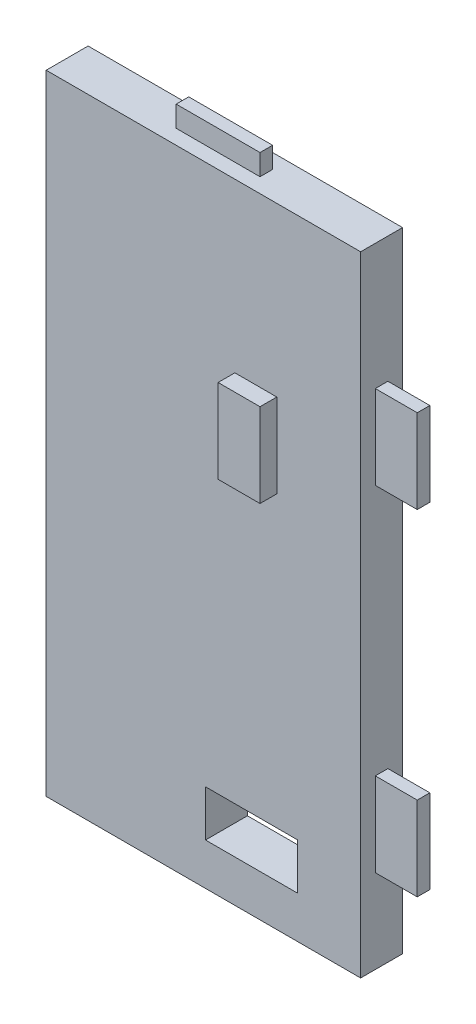
ISO-10303-21;
HEADER;
FILE_DESCRIPTION(('STEP AP214'),'2;1');
FILE_NAME('part.step','',(''),(''),'','','');
FILE_SCHEMA(('AUTOMOTIVE_DESIGN { 1 0 10303 214 1 1 1 1 }'));
ENDSEC;
DATA;
#1=APPLICATION_CONTEXT('core data for automotive mechanical design processes');
#2=APPLICATION_PROTOCOL_DEFINITION('international standard','automotive_design',2000,#1);
#3=PRODUCT_CONTEXT('',#1,'mechanical');
#4=PRODUCT('Part','Part','',(#3));
#5=PRODUCT_RELATED_PRODUCT_CATEGORY('part','',(#4));
#6=PRODUCT_DEFINITION_FORMATION('','',#4);
#7=PRODUCT_DEFINITION_CONTEXT('part definition',#1,'design');
#8=PRODUCT_DEFINITION('design','',#6,#7);
#9=PRODUCT_DEFINITION_SHAPE('','',#8);
#10=(LENGTH_UNIT() NAMED_UNIT(*) SI_UNIT(.MILLI.,.METRE.));
#11=(NAMED_UNIT(*) PLANE_ANGLE_UNIT() SI_UNIT($,.RADIAN.));
#12=(NAMED_UNIT(*) SI_UNIT($,.STERADIAN.) SOLID_ANGLE_UNIT());
#13=UNCERTAINTY_MEASURE_WITH_UNIT(LENGTH_MEASURE(1.E-05),#10,'distance_accuracy_value','');
#14=(GEOMETRIC_REPRESENTATION_CONTEXT(3) GLOBAL_UNCERTAINTY_ASSIGNED_CONTEXT((#13)) GLOBAL_UNIT_ASSIGNED_CONTEXT((#10,
#11,#12)) REPRESENTATION_CONTEXT('',''));
#15=CARTESIAN_POINT('',(0.,0.,0.));
#16=DIRECTION('',(0.,0.,1.));
#17=DIRECTION('',(1.,0.,0.));
#18=AXIS2_PLACEMENT_3D('',#15,#16,#17);
#19=CARTESIAN_POINT('',(37.5,75.,10.));
#20=DIRECTION('',(0.,-1.,0.));
#21=DIRECTION('',(0.,0.,-1.));
#22=AXIS2_PLACEMENT_3D('',#19,#20,#21);
#23=PLANE('',#22);
#24=DIRECTION('',(-1.,0.,0.));
#25=VECTOR('',#24,1.);
#26=CARTESIAN_POINT('',(37.5,75.,0.));
#27=LINE('',#26,#25);
#28=CARTESIAN_POINT('',(37.5,75.,0.));
#29=VERTEX_POINT('',#28);
#30=CARTESIAN_POINT('',(-37.5,75.,0.));
#31=VERTEX_POINT('',#30);
#32=EDGE_CURVE('E354',#29,#31,#27,.T.);
#33=ORIENTED_EDGE('',*,*,#32,.T.);
#34=DIRECTION('',(0.,0.,-1.));
#35=VECTOR('',#34,1.);
#36=CARTESIAN_POINT('',(-37.5,75.,10.));
#37=LINE('',#36,#35);
#38=CARTESIAN_POINT('',(-37.5,75.,10.));
#39=VERTEX_POINT('',#38);
#40=EDGE_CURVE('E11',#39,#31,#37,.T.);
#41=ORIENTED_EDGE('',*,*,#40,.F.);
#42=DIRECTION('',(-1.,0.,0.));
#43=VECTOR('',#42,1.);
#44=CARTESIAN_POINT('',(37.5,75.,10.));
#45=LINE('',#44,#43);
#46=CARTESIAN_POINT('',(37.5,75.,10.));
#47=VERTEX_POINT('',#46);
#48=EDGE_CURVE('E351',#47,#39,#45,.T.);
#49=ORIENTED_EDGE('',*,*,#48,.F.);
#50=DIRECTION('',(0.,0.,-1.));
#51=VECTOR('',#50,1.);
#52=CARTESIAN_POINT('',(37.5,75.,10.));
#53=LINE('',#52,#51);
#54=EDGE_CURVE('E364',#47,#29,#53,.T.);
#55=ORIENTED_EDGE('',*,*,#54,.T.);
#56=EDGE_LOOP('',(#33,#41,#49,#55));
#57=FACE_BOUND('',#56,.T.);
#58=DIRECTION('',(0.,0.,1.));
#59=VECTOR('',#58,1.);
#60=CARTESIAN_POINT('',(-10.,75.,3.5));
#61=LINE('',#60,#59);
#62=CARTESIAN_POINT('',(-10.,75.,3.5));
#63=VERTEX_POINT('',#62);
#64=CARTESIAN_POINT('',(-10.,75.,6.5));
#65=VERTEX_POINT('',#64);
#66=EDGE_CURVE('E52',#63,#65,#61,.T.);
#67=ORIENTED_EDGE('',*,*,#66,.F.);
#68=DIRECTION('',(-1.,0.,0.));
#69=VECTOR('',#68,1.);
#70=CARTESIAN_POINT('',(10.,75.,3.5));
#71=LINE('',#70,#69);
#72=CARTESIAN_POINT('',(10.,75.,3.5));
#73=VERTEX_POINT('',#72);
#74=EDGE_CURVE('E60',#73,#63,#71,.T.);
#75=ORIENTED_EDGE('',*,*,#74,.F.);
#76=DIRECTION('',(0.,0.,-1.));
#77=VECTOR('',#76,1.);
#78=CARTESIAN_POINT('',(10.,75.,3.5));
#79=LINE('',#78,#77);
#80=CARTESIAN_POINT('',(10.,75.,6.5));
#81=VERTEX_POINT('',#80);
#82=EDGE_CURVE('E686',#81,#73,#79,.T.);
#83=ORIENTED_EDGE('',*,*,#82,.F.);
#84=DIRECTION('',(1.,0.,0.));
#85=VECTOR('',#84,1.);
#86=CARTESIAN_POINT('',(10.,75.,6.5));
#87=LINE('',#86,#85);
#88=EDGE_CURVE('E691',#65,#81,#87,.T.);
#89=ORIENTED_EDGE('',*,*,#88,.F.);
#90=EDGE_LOOP('',(#67,#75,#83,#89));
#91=FACE_BOUND('',#90,.T.);
#92=ADVANCED_FACE('F39',(#57,#91),#23,.F.);
#93=CARTESIAN_POINT('',(37.5,-75.,10.));
#94=DIRECTION('',(-1.,0.,0.));
#95=DIRECTION('',(0.,0.,1.));
#96=AXIS2_PLACEMENT_3D('',#93,#94,#95);
#97=PLANE('',#96);
#98=DIRECTION('',(0.,0.,1.));
#99=VECTOR('',#98,1.);
#100=CARTESIAN_POINT('',(37.5,45.,3.5));
#101=LINE('',#100,#99);
#102=CARTESIAN_POINT('',(37.5,45.,3.5));
#103=VERTEX_POINT('',#102);
#104=CARTESIAN_POINT('',(37.5,45.,6.5));
#105=VERTEX_POINT('',#104);
#106=EDGE_CURVE('E243',#103,#105,#101,.T.);
#107=ORIENTED_EDGE('',*,*,#106,.F.);
#108=DIRECTION('',(0.,1.,0.));
#109=VECTOR('',#108,1.);
#110=CARTESIAN_POINT('',(37.5,25.,3.5));
#111=LINE('',#110,#109);
#112=CARTESIAN_POINT('',(37.5,25.,3.5));
#113=VERTEX_POINT('',#112);
#114=EDGE_CURVE('E275',#113,#103,#111,.T.);
#115=ORIENTED_EDGE('',*,*,#114,.F.);
#116=DIRECTION('',(0.,0.,-1.));
#117=VECTOR('',#116,1.);
#118=CARTESIAN_POINT('',(37.5,25.,3.5));
#119=LINE('',#118,#117);
#120=CARTESIAN_POINT('',(37.5,25.,6.5));
#121=VERTEX_POINT('',#120);
#122=EDGE_CURVE('E274',#121,#113,#119,.T.);
#123=ORIENTED_EDGE('',*,*,#122,.F.);
#124=DIRECTION('',(0.,-1.,0.));
#125=VECTOR('',#124,1.);
#126=CARTESIAN_POINT('',(37.5,25.,6.5));
#127=LINE('',#126,#125);
#128=EDGE_CURVE('E276',#105,#121,#127,.T.);
#129=ORIENTED_EDGE('',*,*,#128,.F.);
#130=EDGE_LOOP('',(#107,#115,#123,#129));
#131=FACE_BOUND('',#130,.T.);
#132=DIRECTION('',(0.,1.,0.));
#133=VECTOR('',#132,1.);
#134=CARTESIAN_POINT('',(37.5,-75.,0.));
#135=LINE('',#134,#133);
#136=CARTESIAN_POINT('',(37.5,-75.,0.));
#137=VERTEX_POINT('',#136);
#138=EDGE_CURVE('E358',#137,#29,#135,.T.);
#139=ORIENTED_EDGE('',*,*,#138,.T.);
#140=ORIENTED_EDGE('',*,*,#54,.F.);
#141=DIRECTION('',(0.,1.,0.));
#142=VECTOR('',#141,1.);
#143=CARTESIAN_POINT('',(37.5,-75.,10.));
#144=LINE('',#143,#142);
#145=CARTESIAN_POINT('',(37.5,-75.,10.));
#146=VERTEX_POINT('',#145);
#147=EDGE_CURVE('E361',#146,#47,#144,.T.);
#148=ORIENTED_EDGE('',*,*,#147,.F.);
#149=DIRECTION('',(0.,0.,-1.));
#150=VECTOR('',#149,1.);
#151=CARTESIAN_POINT('',(37.5,-75.,10.));
#152=LINE('',#151,#150);
#153=EDGE_CURVE('E374',#146,#137,#152,.T.);
#154=ORIENTED_EDGE('',*,*,#153,.T.);
#155=EDGE_LOOP('',(#139,#140,#148,#154));
#156=FACE_BOUND('',#155,.T.);
#157=DIRECTION('',(0.,0.,1.));
#158=VECTOR('',#157,1.);
#159=CARTESIAN_POINT('',(37.5,-35.,3.5));
#160=LINE('',#159,#158);
#161=CARTESIAN_POINT('',(37.5,-35.,3.5));
#162=VERTEX_POINT('',#161);
#163=CARTESIAN_POINT('',(37.5,-35.,6.5));
#164=VERTEX_POINT('',#163);
#165=EDGE_CURVE('E239',#162,#164,#160,.T.);
#166=ORIENTED_EDGE('',*,*,#165,.F.);
#167=DIRECTION('',(0.,1.,0.));
#168=VECTOR('',#167,1.);
#169=CARTESIAN_POINT('',(37.5,-55.,3.5));
#170=LINE('',#169,#168);
#171=CARTESIAN_POINT('',(37.5,-55.,3.5));
#172=VERTEX_POINT('',#171);
#173=EDGE_CURVE('E231',#172,#162,#170,.T.);
#174=ORIENTED_EDGE('',*,*,#173,.F.);
#175=DIRECTION('',(0.,0.,-1.));
#176=VECTOR('',#175,1.);
#177=CARTESIAN_POINT('',(37.5,-55.,3.5));
#178=LINE('',#177,#176);
#179=CARTESIAN_POINT('',(37.5,-55.,6.5));
#180=VERTEX_POINT('',#179);
#181=EDGE_CURVE('E249',#180,#172,#178,.T.);
#182=ORIENTED_EDGE('',*,*,#181,.F.);
#183=DIRECTION('',(0.,-1.,0.));
#184=VECTOR('',#183,1.);
#185=CARTESIAN_POINT('',(37.5,-55.,6.5));
#186=LINE('',#185,#184);
#187=EDGE_CURVE('E245',#164,#180,#186,.T.);
#188=ORIENTED_EDGE('',*,*,#187,.F.);
#189=EDGE_LOOP('',(#166,#174,#182,#188));
#190=FACE_BOUND('',#189,.T.);
#191=ADVANCED_FACE('F395',(#131,#156,#190),#97,.F.);
#192=CARTESIAN_POINT('',(0.,0.,10.));
#193=DIRECTION('',(0.,0.,-1.));
#194=DIRECTION('',(-1.,0.,0.));
#195=AXIS2_PLACEMENT_3D('',#192,#193,#194);
#196=PLANE('',#195);
#197=DIRECTION('',(-1.,0.,0.));
#198=VECTOR('',#197,1.);
#199=CARTESIAN_POINT('',(22.5,-54.,10.));
#200=LINE('',#199,#198);
#201=CARTESIAN_POINT('',(22.5,-54.,10.));
#202=VERTEX_POINT('',#201);
#203=CARTESIAN_POINT('',(0.499999999999994,-54.,10.));
#204=VERTEX_POINT('',#203);
#205=EDGE_CURVE('E322',#202,#204,#200,.T.);
#206=ORIENTED_EDGE('',*,*,#205,.F.);
#207=DIRECTION('',(0.,1.,0.));
#208=VECTOR('',#207,1.);
#209=CARTESIAN_POINT('',(22.5,-65.,10.));
#210=LINE('',#209,#208);
#211=CARTESIAN_POINT('',(22.5,-65.,10.));
#212=VERTEX_POINT('',#211);
#213=EDGE_CURVE('E335',#212,#202,#210,.T.);
#214=ORIENTED_EDGE('',*,*,#213,.F.);
#215=DIRECTION('',(1.,0.,0.));
#216=VECTOR('',#215,1.);
#217=CARTESIAN_POINT('',(22.5,-65.,10.));
#218=LINE('',#217,#216);
#219=CARTESIAN_POINT('',(0.499999999999994,-65.,10.));
#220=VERTEX_POINT('',#219);
#221=EDGE_CURVE('E328',#220,#212,#218,.T.);
#222=ORIENTED_EDGE('',*,*,#221,.F.);
#223=DIRECTION('',(0.,-1.,0.));
#224=VECTOR('',#223,1.);
#225=CARTESIAN_POINT('',(0.499999999999994,-65.,10.));
#226=LINE('',#225,#224);
#227=EDGE_CURVE('E326',#204,#220,#226,.T.);
#228=ORIENTED_EDGE('',*,*,#227,.F.);
#229=EDGE_LOOP('',(#206,#214,#222,#228));
#230=FACE_BOUND('',#229,.T.);
#231=ORIENTED_EDGE('',*,*,#48,.T.);
#232=DIRECTION('',(0.,-1.,0.));
#233=VECTOR('',#232,1.);
#234=CARTESIAN_POINT('',(-37.5,-75.,10.));
#235=LINE('',#234,#233);
#236=CARTESIAN_POINT('',(-37.5,-75.,10.));
#237=VERTEX_POINT('',#236);
#238=EDGE_CURVE('E360',#39,#237,#235,.T.);
#239=ORIENTED_EDGE('',*,*,#238,.T.);
#240=DIRECTION('',(1.,0.,0.));
#241=VECTOR('',#240,1.);
#242=CARTESIAN_POINT('',(37.5,-75.,10.));
#243=LINE('',#242,#241);
#244=EDGE_CURVE('E363',#237,#146,#243,.T.);
#245=ORIENTED_EDGE('',*,*,#244,.T.);
#246=ORIENTED_EDGE('',*,*,#147,.T.);
#247=EDGE_LOOP('',(#231,#239,#245,#246));
#248=FACE_BOUND('',#247,.T.);
#249=DIRECTION('',(0.,1.,0.));
#250=VECTOR('',#249,1.);
#251=CARTESIAN_POINT('',(17.5,15.,10.));
#252=LINE('',#251,#250);
#253=CARTESIAN_POINT('',(17.5,15.,10.));
#254=VERTEX_POINT('',#253);
#255=CARTESIAN_POINT('',(17.5,35.,10.));
#256=VERTEX_POINT('',#255);
#257=EDGE_CURVE('E261',#254,#256,#252,.T.);
#258=ORIENTED_EDGE('',*,*,#257,.F.);
#259=DIRECTION('',(1.,0.,0.));
#260=VECTOR('',#259,1.);
#261=CARTESIAN_POINT('',(7.49999999999999,15.,10.));
#262=LINE('',#261,#260);
#263=CARTESIAN_POINT('',(7.49999999999999,15.,10.));
#264=VERTEX_POINT('',#263);
#265=EDGE_CURVE('E293',#264,#254,#262,.T.);
#266=ORIENTED_EDGE('',*,*,#265,.F.);
#267=DIRECTION('',(0.,-1.,0.));
#268=VECTOR('',#267,1.);
#269=CARTESIAN_POINT('',(7.49999999999999,15.,10.));
#270=LINE('',#269,#268);
#271=CARTESIAN_POINT('',(7.49999999999999,35.,10.));
#272=VERTEX_POINT('',#271);
#273=EDGE_CURVE('E307',#272,#264,#270,.T.);
#274=ORIENTED_EDGE('',*,*,#273,.F.);
#275=DIRECTION('',(-1.,0.,0.));
#276=VECTOR('',#275,1.);
#277=CARTESIAN_POINT('',(7.49999999999999,35.,10.));
#278=LINE('',#277,#276);
#279=EDGE_CURVE('E303',#256,#272,#278,.T.);
#280=ORIENTED_EDGE('',*,*,#279,.F.);
#281=EDGE_LOOP('',(#258,#266,#274,#280));
#282=FACE_BOUND('',#281,.T.);
#283=ADVANCED_FACE('F398',(#230,#248,#282),#196,.F.);
#284=CARTESIAN_POINT('',(0.,0.,0.));
#285=DIRECTION('',(0.,0.,-1.));
#286=DIRECTION('',(-1.,0.,0.));
#287=AXIS2_PLACEMENT_3D('',#284,#285,#286);
#288=PLANE('',#287);
#289=ORIENTED_EDGE('',*,*,#32,.F.);
#290=ORIENTED_EDGE('',*,*,#138,.F.);
#291=DIRECTION('',(1.,0.,0.));
#292=VECTOR('',#291,1.);
#293=CARTESIAN_POINT('',(37.5,-75.,0.));
#294=LINE('',#293,#292);
#295=CARTESIAN_POINT('',(-37.5,-75.,0.));
#296=VERTEX_POINT('',#295);
#297=EDGE_CURVE('E367',#296,#137,#294,.T.);
#298=ORIENTED_EDGE('',*,*,#297,.F.);
#299=DIRECTION('',(0.,-1.,0.));
#300=VECTOR('',#299,1.);
#301=CARTESIAN_POINT('',(-37.5,-75.,0.));
#302=LINE('',#301,#300);
#303=EDGE_CURVE('E366',#31,#296,#302,.T.);
#304=ORIENTED_EDGE('',*,*,#303,.F.);
#305=EDGE_LOOP('',(#289,#290,#298,#304));
#306=FACE_BOUND('',#305,.T.);
#307=DIRECTION('',(0.,1.,0.));
#308=VECTOR('',#307,1.);
#309=CARTESIAN_POINT('',(22.5,-65.,0.));
#310=LINE('',#309,#308);
#311=CARTESIAN_POINT('',(22.5,-65.,0.));
#312=VERTEX_POINT('',#311);
#313=CARTESIAN_POINT('',(22.5,-54.,0.));
#314=VERTEX_POINT('',#313);
#315=EDGE_CURVE('E330',#312,#314,#310,.T.);
#316=ORIENTED_EDGE('',*,*,#315,.T.);
#317=DIRECTION('',(-1.,0.,0.));
#318=VECTOR('',#317,1.);
#319=CARTESIAN_POINT('',(22.5,-54.,0.));
#320=LINE('',#319,#318);
#321=CARTESIAN_POINT('',(0.499999999999994,-54.,0.));
#322=VERTEX_POINT('',#321);
#323=EDGE_CURVE('E323',#314,#322,#320,.T.);
#324=ORIENTED_EDGE('',*,*,#323,.T.);
#325=DIRECTION('',(0.,-1.,0.));
#326=VECTOR('',#325,1.);
#327=CARTESIAN_POINT('',(0.499999999999994,-65.,0.));
#328=LINE('',#327,#326);
#329=CARTESIAN_POINT('',(0.499999999999994,-65.,0.));
#330=VERTEX_POINT('',#329);
#331=EDGE_CURVE('E340',#322,#330,#328,.T.);
#332=ORIENTED_EDGE('',*,*,#331,.T.);
#333=DIRECTION('',(1.,0.,0.));
#334=VECTOR('',#333,1.);
#335=CARTESIAN_POINT('',(22.5,-65.,0.));
#336=LINE('',#335,#334);
#337=EDGE_CURVE('E336',#330,#312,#336,.T.);
#338=ORIENTED_EDGE('',*,*,#337,.T.);
#339=EDGE_LOOP('',(#316,#324,#332,#338));
#340=FACE_BOUND('',#339,.T.);
#341=ADVANCED_FACE('F389',(#306,#340),#288,.T.);
#342=CARTESIAN_POINT('',(-37.5,-75.,10.));
#343=DIRECTION('',(1.,0.,0.));
#344=DIRECTION('',(0.,0.,-1.));
#345=AXIS2_PLACEMENT_3D('',#342,#343,#344);
#346=PLANE('',#345);
#347=ORIENTED_EDGE('',*,*,#303,.T.);
#348=DIRECTION('',(0.,0.,-1.));
#349=VECTOR('',#348,1.);
#350=CARTESIAN_POINT('',(-37.5,-75.,10.));
#351=LINE('',#350,#349);
#352=EDGE_CURVE('E46',#237,#296,#351,.T.);
#353=ORIENTED_EDGE('',*,*,#352,.F.);
#354=ORIENTED_EDGE('',*,*,#238,.F.);
#355=ORIENTED_EDGE('',*,*,#40,.T.);
#356=EDGE_LOOP('',(#347,#353,#354,#355));
#357=FACE_BOUND('',#356,.T.);
#358=ADVANCED_FACE('F402',(#357),#346,.F.);
#359=CARTESIAN_POINT('',(37.5,-75.,10.));
#360=DIRECTION('',(0.,1.,0.));
#361=DIRECTION('',(0.,0.,1.));
#362=AXIS2_PLACEMENT_3D('',#359,#360,#361);
#363=PLANE('',#362);
#364=ORIENTED_EDGE('',*,*,#297,.T.);
#365=ORIENTED_EDGE('',*,*,#153,.F.);
#366=ORIENTED_EDGE('',*,*,#244,.F.);
#367=ORIENTED_EDGE('',*,*,#352,.T.);
#368=EDGE_LOOP('',(#364,#365,#366,#367));
#369=FACE_BOUND('',#368,.T.);
#370=ADVANCED_FACE('F385',(#369),#363,.F.);
#371=CARTESIAN_POINT('',(22.5,-54.,10.));
#372=DIRECTION('',(0.,-1.,0.));
#373=DIRECTION('',(0.,0.,-1.));
#374=AXIS2_PLACEMENT_3D('',#371,#372,#373);
#375=PLANE('',#374);
#376=ORIENTED_EDGE('',*,*,#323,.F.);
#377=DIRECTION('',(0.,0.,-1.));
#378=VECTOR('',#377,1.);
#379=CARTESIAN_POINT('',(22.5,-54.,10.));
#380=LINE('',#379,#378);
#381=EDGE_CURVE('E331',#202,#314,#380,.T.);
#382=ORIENTED_EDGE('',*,*,#381,.F.);
#383=ORIENTED_EDGE('',*,*,#205,.T.);
#384=DIRECTION('',(0.,0.,-1.));
#385=VECTOR('',#384,1.);
#386=CARTESIAN_POINT('',(0.499999999999994,-54.,10.));
#387=LINE('',#386,#385);
#388=EDGE_CURVE('E352',#204,#322,#387,.T.);
#389=ORIENTED_EDGE('',*,*,#388,.T.);
#390=EDGE_LOOP('',(#376,#382,#383,#389));
#391=FACE_BOUND('',#390,.T.);
#392=ADVANCED_FACE('F410',(#391),#375,.T.);
#393=CARTESIAN_POINT('',(0.499999999999994,-65.,10.));
#394=DIRECTION('',(1.,0.,0.));
#395=DIRECTION('',(0.,0.,-1.));
#396=AXIS2_PLACEMENT_3D('',#393,#394,#395);
#397=PLANE('',#396);
#398=ORIENTED_EDGE('',*,*,#331,.F.);
#399=ORIENTED_EDGE('',*,*,#388,.F.);
#400=ORIENTED_EDGE('',*,*,#227,.T.);
#401=DIRECTION('',(0.,0.,-1.));
#402=VECTOR('',#401,1.);
#403=CARTESIAN_POINT('',(0.499999999999994,-65.,10.));
#404=LINE('',#403,#402);
#405=EDGE_CURVE('E349',#220,#330,#404,.T.);
#406=ORIENTED_EDGE('',*,*,#405,.T.);
#407=EDGE_LOOP('',(#398,#399,#400,#406));
#408=FACE_BOUND('',#407,.T.);
#409=ADVANCED_FACE('F428',(#408),#397,.T.);
#410=CARTESIAN_POINT('',(22.5,-65.,10.));
#411=DIRECTION('',(0.,1.,0.));
#412=DIRECTION('',(0.,0.,1.));
#413=AXIS2_PLACEMENT_3D('',#410,#411,#412);
#414=PLANE('',#413);
#415=ORIENTED_EDGE('',*,*,#337,.F.);
#416=ORIENTED_EDGE('',*,*,#405,.F.);
#417=ORIENTED_EDGE('',*,*,#221,.T.);
#418=DIRECTION('',(0.,0.,-1.));
#419=VECTOR('',#418,1.);
#420=CARTESIAN_POINT('',(22.5,-65.,10.));
#421=LINE('',#420,#419);
#422=EDGE_CURVE('E350',#212,#312,#421,.T.);
#423=ORIENTED_EDGE('',*,*,#422,.T.);
#424=EDGE_LOOP('',(#415,#416,#417,#423));
#425=FACE_BOUND('',#424,.T.);
#426=ADVANCED_FACE('F435',(#425),#414,.T.);
#427=CARTESIAN_POINT('',(22.5,-65.,10.));
#428=DIRECTION('',(-1.,0.,0.));
#429=DIRECTION('',(0.,0.,1.));
#430=AXIS2_PLACEMENT_3D('',#427,#428,#429);
#431=PLANE('',#430);
#432=ORIENTED_EDGE('',*,*,#315,.F.);
#433=ORIENTED_EDGE('',*,*,#422,.F.);
#434=ORIENTED_EDGE('',*,*,#213,.T.);
#435=ORIENTED_EDGE('',*,*,#381,.T.);
#436=EDGE_LOOP('',(#432,#433,#434,#435));
#437=FACE_BOUND('',#436,.T.);
#438=ADVANCED_FACE('F436',(#437),#431,.T.);
#439=CARTESIAN_POINT('',(17.5,15.,14.));
#440=DIRECTION('',(-1.,0.,0.));
#441=DIRECTION('',(0.,0.,1.));
#442=AXIS2_PLACEMENT_3D('',#439,#440,#441);
#443=PLANE('',#442);
#444=ORIENTED_EDGE('',*,*,#257,.T.);
#445=DIRECTION('',(0.,0.,-1.));
#446=VECTOR('',#445,1.);
#447=CARTESIAN_POINT('',(17.5,35.,14.));
#448=LINE('',#447,#446);
#449=CARTESIAN_POINT('',(17.5,35.,14.));
#450=VERTEX_POINT('',#449);
#451=EDGE_CURVE('E319',#450,#256,#448,.T.);
#452=ORIENTED_EDGE('',*,*,#451,.F.);
#453=DIRECTION('',(0.,1.,0.));
#454=VECTOR('',#453,1.);
#455=CARTESIAN_POINT('',(17.5,15.,14.));
#456=LINE('',#455,#454);
#457=CARTESIAN_POINT('',(17.5,15.,14.));
#458=VERTEX_POINT('',#457);
#459=EDGE_CURVE('E292',#458,#450,#456,.T.);
#460=ORIENTED_EDGE('',*,*,#459,.F.);
#461=DIRECTION('',(0.,0.,-1.));
#462=VECTOR('',#461,1.);
#463=CARTESIAN_POINT('',(17.5,15.,14.));
#464=LINE('',#463,#462);
#465=EDGE_CURVE('E304',#458,#254,#464,.T.);
#466=ORIENTED_EDGE('',*,*,#465,.T.);
#467=EDGE_LOOP('',(#444,#452,#460,#466));
#468=FACE_BOUND('',#467,.T.);
#469=ADVANCED_FACE('F439',(#468),#443,.F.);
#470=CARTESIAN_POINT('',(7.49999999999999,35.,14.));
#471=DIRECTION('',(0.,-1.,0.));
#472=DIRECTION('',(0.,0.,-1.));
#473=AXIS2_PLACEMENT_3D('',#470,#471,#472);
#474=PLANE('',#473);
#475=ORIENTED_EDGE('',*,*,#279,.T.);
#476=DIRECTION('',(0.,0.,-1.));
#477=VECTOR('',#476,1.);
#478=CARTESIAN_POINT('',(7.49999999999999,35.,14.));
#479=LINE('',#478,#477);
#480=CARTESIAN_POINT('',(7.49999999999999,35.,14.));
#481=VERTEX_POINT('',#480);
#482=EDGE_CURVE('E320',#481,#272,#479,.T.);
#483=ORIENTED_EDGE('',*,*,#482,.F.);
#484=DIRECTION('',(-1.,0.,0.));
#485=VECTOR('',#484,1.);
#486=CARTESIAN_POINT('',(7.49999999999999,35.,14.));
#487=LINE('',#486,#485);
#488=EDGE_CURVE('E294',#450,#481,#487,.T.);
#489=ORIENTED_EDGE('',*,*,#488,.F.);
#490=ORIENTED_EDGE('',*,*,#451,.T.);
#491=EDGE_LOOP('',(#475,#483,#489,#490));
#492=FACE_BOUND('',#491,.T.);
#493=ADVANCED_FACE('F441',(#492),#474,.F.);
#494=CARTESIAN_POINT('',(7.49999999999999,15.,14.));
#495=DIRECTION('',(1.,0.,0.));
#496=DIRECTION('',(0.,0.,-1.));
#497=AXIS2_PLACEMENT_3D('',#494,#495,#496);
#498=PLANE('',#497);
#499=ORIENTED_EDGE('',*,*,#273,.T.);
#500=DIRECTION('',(0.,0.,-1.));
#501=VECTOR('',#500,1.);
#502=CARTESIAN_POINT('',(7.49999999999999,15.,14.));
#503=LINE('',#502,#501);
#504=CARTESIAN_POINT('',(7.49999999999999,15.,14.));
#505=VERTEX_POINT('',#504);
#506=EDGE_CURVE('E314',#505,#264,#503,.T.);
#507=ORIENTED_EDGE('',*,*,#506,.F.);
#508=DIRECTION('',(0.,-1.,0.));
#509=VECTOR('',#508,1.);
#510=CARTESIAN_POINT('',(7.49999999999999,15.,14.));
#511=LINE('',#510,#509);
#512=EDGE_CURVE('E300',#481,#505,#511,.T.);
#513=ORIENTED_EDGE('',*,*,#512,.F.);
#514=ORIENTED_EDGE('',*,*,#482,.T.);
#515=EDGE_LOOP('',(#499,#507,#513,#514));
#516=FACE_BOUND('',#515,.T.);
#517=ADVANCED_FACE('F448',(#516),#498,.F.);
#518=CARTESIAN_POINT('',(7.49999999999999,15.,14.));
#519=DIRECTION('',(0.,1.,0.));
#520=DIRECTION('',(0.,0.,1.));
#521=AXIS2_PLACEMENT_3D('',#518,#519,#520);
#522=PLANE('',#521);
#523=ORIENTED_EDGE('',*,*,#265,.T.);
#524=ORIENTED_EDGE('',*,*,#465,.F.);
#525=DIRECTION('',(1.,0.,0.));
#526=VECTOR('',#525,1.);
#527=CARTESIAN_POINT('',(7.49999999999999,15.,14.));
#528=LINE('',#527,#526);
#529=EDGE_CURVE('E299',#505,#458,#528,.T.);
#530=ORIENTED_EDGE('',*,*,#529,.F.);
#531=ORIENTED_EDGE('',*,*,#506,.T.);
#532=EDGE_LOOP('',(#523,#524,#530,#531));
#533=FACE_BOUND('',#532,.T.);
#534=ADVANCED_FACE('F451',(#533),#522,.F.);
#535=CARTESIAN_POINT('',(0.,0.,14.));
#536=DIRECTION('',(0.,0.,-1.));
#537=DIRECTION('',(-1.,0.,0.));
#538=AXIS2_PLACEMENT_3D('',#535,#536,#537);
#539=PLANE('',#538);
#540=ORIENTED_EDGE('',*,*,#459,.T.);
#541=ORIENTED_EDGE('',*,*,#488,.T.);
#542=ORIENTED_EDGE('',*,*,#512,.T.);
#543=ORIENTED_EDGE('',*,*,#529,.T.);
#544=EDGE_LOOP('',(#540,#541,#542,#543));
#545=FACE_BOUND('',#544,.T.);
#546=ADVANCED_FACE('F457',(#545),#539,.F.);
#547=CARTESIAN_POINT('',(47.5,45.,3.5));
#548=DIRECTION('',(0.,-1.,0.));
#549=DIRECTION('',(0.,0.,-1.));
#550=AXIS2_PLACEMENT_3D('',#547,#548,#549);
#551=PLANE('',#550);
#552=ORIENTED_EDGE('',*,*,#106,.T.);
#553=DIRECTION('',(-1.,0.,0.));
#554=VECTOR('',#553,1.);
#555=CARTESIAN_POINT('',(47.5,45.,6.5));
#556=LINE('',#555,#554);
#557=CARTESIAN_POINT('',(47.5,45.,6.5));
#558=VERTEX_POINT('',#557);
#559=EDGE_CURVE('E218',#558,#105,#556,.T.);
#560=ORIENTED_EDGE('',*,*,#559,.F.);
#561=DIRECTION('',(0.,0.,1.));
#562=VECTOR('',#561,1.);
#563=CARTESIAN_POINT('',(47.5,45.,3.5));
#564=LINE('',#563,#562);
#565=CARTESIAN_POINT('',(47.5,45.,3.5));
#566=VERTEX_POINT('',#565);
#567=EDGE_CURVE('E277',#566,#558,#564,.T.);
#568=ORIENTED_EDGE('',*,*,#567,.F.);
#569=DIRECTION('',(-1.,0.,0.));
#570=VECTOR('',#569,1.);
#571=CARTESIAN_POINT('',(47.5,45.,3.5));
#572=LINE('',#571,#570);
#573=EDGE_CURVE('E268',#566,#103,#572,.T.);
#574=ORIENTED_EDGE('',*,*,#573,.T.);
#575=EDGE_LOOP('',(#552,#560,#568,#574));
#576=FACE_BOUND('',#575,.T.);
#577=ADVANCED_FACE('F459',(#576),#551,.F.);
#578=CARTESIAN_POINT('',(47.5,25.,6.5));
#579=DIRECTION('',(0.,0.,-1.));
#580=DIRECTION('',(0.,1.,0.));
#581=AXIS2_PLACEMENT_3D('',#578,#579,#580);
#582=PLANE('',#581);
#583=ORIENTED_EDGE('',*,*,#128,.T.);
#584=DIRECTION('',(-1.,0.,0.));
#585=VECTOR('',#584,1.);
#586=CARTESIAN_POINT('',(47.5,25.,6.5));
#587=LINE('',#586,#585);
#588=CARTESIAN_POINT('',(47.5,25.,6.5));
#589=VERTEX_POINT('',#588);
#590=EDGE_CURVE('E225',#589,#121,#587,.T.);
#591=ORIENTED_EDGE('',*,*,#590,.F.);
#592=DIRECTION('',(0.,-1.,0.));
#593=VECTOR('',#592,1.);
#594=CARTESIAN_POINT('',(47.5,25.,6.5));
#595=LINE('',#594,#593);
#596=EDGE_CURVE('E286',#558,#589,#595,.T.);
#597=ORIENTED_EDGE('',*,*,#596,.F.);
#598=ORIENTED_EDGE('',*,*,#559,.T.);
#599=EDGE_LOOP('',(#583,#591,#597,#598));
#600=FACE_BOUND('',#599,.T.);
#601=ADVANCED_FACE('F471',(#600),#582,.F.);
#602=CARTESIAN_POINT('',(47.5,25.,3.5));
#603=DIRECTION('',(0.,1.,0.));
#604=DIRECTION('',(0.,0.,1.));
#605=AXIS2_PLACEMENT_3D('',#602,#603,#604);
#606=PLANE('',#605);
#607=ORIENTED_EDGE('',*,*,#122,.T.);
#608=DIRECTION('',(-1.,0.,0.));
#609=VECTOR('',#608,1.);
#610=CARTESIAN_POINT('',(47.5,25.,3.5));
#611=LINE('',#610,#609);
#612=CARTESIAN_POINT('',(47.5,25.,3.5));
#613=VERTEX_POINT('',#612);
#614=EDGE_CURVE('E264',#613,#113,#611,.T.);
#615=ORIENTED_EDGE('',*,*,#614,.F.);
#616=DIRECTION('',(0.,0.,-1.));
#617=VECTOR('',#616,1.);
#618=CARTESIAN_POINT('',(47.5,25.,3.5));
#619=LINE('',#618,#617);
#620=EDGE_CURVE('E281',#589,#613,#619,.T.);
#621=ORIENTED_EDGE('',*,*,#620,.F.);
#622=ORIENTED_EDGE('',*,*,#590,.T.);
#623=EDGE_LOOP('',(#607,#615,#621,#622));
#624=FACE_BOUND('',#623,.T.);
#625=ADVANCED_FACE('F468',(#624),#606,.F.);
#626=CARTESIAN_POINT('',(47.5,25.,3.5));
#627=DIRECTION('',(0.,0.,1.));
#628=DIRECTION('',(0.,-1.,0.));
#629=AXIS2_PLACEMENT_3D('',#626,#627,#628);
#630=PLANE('',#629);
#631=ORIENTED_EDGE('',*,*,#114,.T.);
#632=ORIENTED_EDGE('',*,*,#573,.F.);
#633=DIRECTION('',(0.,1.,0.));
#634=VECTOR('',#633,1.);
#635=CARTESIAN_POINT('',(47.5,25.,3.5));
#636=LINE('',#635,#634);
#637=EDGE_CURVE('E271',#613,#566,#636,.T.);
#638=ORIENTED_EDGE('',*,*,#637,.F.);
#639=ORIENTED_EDGE('',*,*,#614,.T.);
#640=EDGE_LOOP('',(#631,#632,#638,#639));
#641=FACE_BOUND('',#640,.T.);
#642=ADVANCED_FACE('F461',(#641),#630,.F.);
#643=CARTESIAN_POINT('',(47.5,0.,0.));
#644=DIRECTION('',(-1.,0.,0.));
#645=DIRECTION('',(0.,0.,1.));
#646=AXIS2_PLACEMENT_3D('',#643,#644,#645);
#647=PLANE('',#646);
#648=ORIENTED_EDGE('',*,*,#567,.T.);
#649=ORIENTED_EDGE('',*,*,#596,.T.);
#650=ORIENTED_EDGE('',*,*,#620,.T.);
#651=ORIENTED_EDGE('',*,*,#637,.T.);
#652=EDGE_LOOP('',(#648,#649,#650,#651));
#653=FACE_BOUND('',#652,.T.);
#654=ADVANCED_FACE('F462',(#653),#647,.F.);
#655=CARTESIAN_POINT('',(47.5,-35.,3.5));
#656=DIRECTION('',(0.,-1.,0.));
#657=DIRECTION('',(0.,0.,-1.));
#658=AXIS2_PLACEMENT_3D('',#655,#656,#657);
#659=PLANE('',#658);
#660=ORIENTED_EDGE('',*,*,#165,.T.);
#661=DIRECTION('',(-1.,0.,0.));
#662=VECTOR('',#661,1.);
#663=CARTESIAN_POINT('',(47.5,-35.,6.5));
#664=LINE('',#663,#662);
#665=CARTESIAN_POINT('',(47.5,-35.,6.5));
#666=VERTEX_POINT('',#665);
#667=EDGE_CURVE('E259',#666,#164,#664,.T.);
#668=ORIENTED_EDGE('',*,*,#667,.F.);
#669=DIRECTION('',(0.,0.,1.));
#670=VECTOR('',#669,1.);
#671=CARTESIAN_POINT('',(47.5,-35.,3.5));
#672=LINE('',#671,#670);
#673=CARTESIAN_POINT('',(47.5,-35.,3.5));
#674=VERTEX_POINT('',#673);
#675=EDGE_CURVE('E228',#674,#666,#672,.T.);
#676=ORIENTED_EDGE('',*,*,#675,.F.);
#677=DIRECTION('',(-1.,0.,0.));
#678=VECTOR('',#677,1.);
#679=CARTESIAN_POINT('',(47.5,-35.,3.5));
#680=LINE('',#679,#678);
#681=EDGE_CURVE('E236',#674,#162,#680,.T.);
#682=ORIENTED_EDGE('',*,*,#681,.T.);
#683=EDGE_LOOP('',(#660,#668,#676,#682));
#684=FACE_BOUND('',#683,.T.);
#685=ADVANCED_FACE('F464',(#684),#659,.F.);
#686=CARTESIAN_POINT('',(47.5,-55.,6.5));
#687=DIRECTION('',(0.,0.,-1.));
#688=DIRECTION('',(0.,1.,0.));
#689=AXIS2_PLACEMENT_3D('',#686,#687,#688);
#690=PLANE('',#689);
#691=ORIENTED_EDGE('',*,*,#187,.T.);
#692=DIRECTION('',(-1.,0.,0.));
#693=VECTOR('',#692,1.);
#694=CARTESIAN_POINT('',(47.5,-55.,6.5));
#695=LINE('',#694,#693);
#696=CARTESIAN_POINT('',(47.5,-55.,6.5));
#697=VERTEX_POINT('',#696);
#698=EDGE_CURVE('E258',#697,#180,#695,.T.);
#699=ORIENTED_EDGE('',*,*,#698,.F.);
#700=DIRECTION('',(0.,-1.,0.));
#701=VECTOR('',#700,1.);
#702=CARTESIAN_POINT('',(47.5,-55.,6.5));
#703=LINE('',#702,#701);
#704=EDGE_CURVE('E234',#666,#697,#703,.T.);
#705=ORIENTED_EDGE('',*,*,#704,.F.);
#706=ORIENTED_EDGE('',*,*,#667,.T.);
#707=EDGE_LOOP('',(#691,#699,#705,#706));
#708=FACE_BOUND('',#707,.T.);
#709=ADVANCED_FACE('F485',(#708),#690,.F.);
#710=CARTESIAN_POINT('',(47.5,-55.,3.5));
#711=DIRECTION('',(0.,1.,0.));
#712=DIRECTION('',(0.,0.,1.));
#713=AXIS2_PLACEMENT_3D('',#710,#711,#712);
#714=PLANE('',#713);
#715=ORIENTED_EDGE('',*,*,#181,.T.);
#716=DIRECTION('',(-1.,0.,0.));
#717=VECTOR('',#716,1.);
#718=CARTESIAN_POINT('',(47.5,-55.,3.5));
#719=LINE('',#718,#717);
#720=CARTESIAN_POINT('',(47.5,-55.,3.5));
#721=VERTEX_POINT('',#720);
#722=EDGE_CURVE('E251',#721,#172,#719,.T.);
#723=ORIENTED_EDGE('',*,*,#722,.F.);
#724=DIRECTION('',(0.,0.,-1.));
#725=VECTOR('',#724,1.);
#726=CARTESIAN_POINT('',(47.5,-55.,3.5));
#727=LINE('',#726,#725);
#728=EDGE_CURVE('E233',#697,#721,#727,.T.);
#729=ORIENTED_EDGE('',*,*,#728,.F.);
#730=ORIENTED_EDGE('',*,*,#698,.T.);
#731=EDGE_LOOP('',(#715,#723,#729,#730));
#732=FACE_BOUND('',#731,.T.);
#733=ADVANCED_FACE('F486',(#732),#714,.F.);
#734=CARTESIAN_POINT('',(47.5,-55.,3.5));
#735=DIRECTION('',(0.,0.,1.));
#736=DIRECTION('',(1.,0.,0.));
#737=AXIS2_PLACEMENT_3D('',#734,#735,#736);
#738=PLANE('',#737);
#739=ORIENTED_EDGE('',*,*,#173,.T.);
#740=ORIENTED_EDGE('',*,*,#681,.F.);
#741=DIRECTION('',(0.,1.,0.));
#742=VECTOR('',#741,1.);
#743=CARTESIAN_POINT('',(47.5,-55.,3.5));
#744=LINE('',#743,#742);
#745=EDGE_CURVE('E237',#721,#674,#744,.T.);
#746=ORIENTED_EDGE('',*,*,#745,.F.);
#747=ORIENTED_EDGE('',*,*,#722,.T.);
#748=EDGE_LOOP('',(#739,#740,#746,#747));
#749=FACE_BOUND('',#748,.T.);
#750=ADVANCED_FACE('F489',(#749),#738,.F.);
#751=CARTESIAN_POINT('',(47.5,0.,0.));
#752=DIRECTION('',(-1.,0.,0.));
#753=DIRECTION('',(0.,0.,1.));
#754=AXIS2_PLACEMENT_3D('',#751,#752,#753);
#755=PLANE('',#754);
#756=ORIENTED_EDGE('',*,*,#675,.T.);
#757=ORIENTED_EDGE('',*,*,#704,.T.);
#758=ORIENTED_EDGE('',*,*,#728,.T.);
#759=ORIENTED_EDGE('',*,*,#745,.T.);
#760=EDGE_LOOP('',(#756,#757,#758,#759));
#761=FACE_BOUND('',#760,.T.);
#762=ADVANCED_FACE('F493',(#761),#755,.F.);
#763=CARTESIAN_POINT('',(-10.,80.,3.5));
#764=DIRECTION('',(1.,0.,0.));
#765=DIRECTION('',(0.,0.,-1.));
#766=AXIS2_PLACEMENT_3D('',#763,#764,#765);
#767=PLANE('',#766);
#768=ORIENTED_EDGE('',*,*,#66,.T.);
#769=DIRECTION('',(0.,-1.,0.));
#770=VECTOR('',#769,1.);
#771=CARTESIAN_POINT('',(-10.,80.,6.5));
#772=LINE('',#771,#770);
#773=CARTESIAN_POINT('',(-10.,80.,6.5));
#774=VERTEX_POINT('',#773);
#775=EDGE_CURVE('E205',#774,#65,#772,.T.);
#776=ORIENTED_EDGE('',*,*,#775,.F.);
#777=DIRECTION('',(0.,0.,1.));
#778=VECTOR('',#777,1.);
#779=CARTESIAN_POINT('',(-10.,80.,3.5));
#780=LINE('',#779,#778);
#781=CARTESIAN_POINT('',(-10.,80.,3.5));
#782=VERTEX_POINT('',#781);
#783=EDGE_CURVE('E208',#782,#774,#780,.T.);
#784=ORIENTED_EDGE('',*,*,#783,.F.);
#785=DIRECTION('',(0.,-1.,0.));
#786=VECTOR('',#785,1.);
#787=CARTESIAN_POINT('',(-10.,80.,3.5));
#788=LINE('',#787,#786);
#789=EDGE_CURVE('E681',#782,#63,#788,.T.);
#790=ORIENTED_EDGE('',*,*,#789,.T.);
#791=EDGE_LOOP('',(#768,#776,#784,#790));
#792=FACE_BOUND('',#791,.T.);
#793=ADVANCED_FACE('F217',(#792),#767,.F.);
#794=CARTESIAN_POINT('',(10.,80.,6.5));
#795=DIRECTION('',(0.,0.,-1.));
#796=DIRECTION('',(-1.,0.,0.));
#797=AXIS2_PLACEMENT_3D('',#794,#795,#796);
#798=PLANE('',#797);
#799=ORIENTED_EDGE('',*,*,#88,.T.);
#800=DIRECTION('',(0.,-1.,0.));
#801=VECTOR('',#800,1.);
#802=CARTESIAN_POINT('',(10.,80.,6.5));
#803=LINE('',#802,#801);
#804=CARTESIAN_POINT('',(10.,80.,6.5));
#805=VERTEX_POINT('',#804);
#806=EDGE_CURVE('E204',#805,#81,#803,.T.);
#807=ORIENTED_EDGE('',*,*,#806,.F.);
#808=DIRECTION('',(1.,0.,0.));
#809=VECTOR('',#808,1.);
#810=CARTESIAN_POINT('',(10.,80.,6.5));
#811=LINE('',#810,#809);
#812=EDGE_CURVE('E197',#774,#805,#811,.T.);
#813=ORIENTED_EDGE('',*,*,#812,.F.);
#814=ORIENTED_EDGE('',*,*,#775,.T.);
#815=EDGE_LOOP('',(#799,#807,#813,#814));
#816=FACE_BOUND('',#815,.T.);
#817=ADVANCED_FACE('F199',(#816),#798,.F.);
#818=CARTESIAN_POINT('',(10.,80.,3.5));
#819=DIRECTION('',(-1.,0.,0.));
#820=DIRECTION('',(0.,0.,1.));
#821=AXIS2_PLACEMENT_3D('',#818,#819,#820);
#822=PLANE('',#821);
#823=ORIENTED_EDGE('',*,*,#82,.T.);
#824=DIRECTION('',(0.,-1.,0.));
#825=VECTOR('',#824,1.);
#826=CARTESIAN_POINT('',(10.,80.,3.5));
#827=LINE('',#826,#825);
#828=CARTESIAN_POINT('',(10.,80.,3.5));
#829=VERTEX_POINT('',#828);
#830=EDGE_CURVE('E221',#829,#73,#827,.T.);
#831=ORIENTED_EDGE('',*,*,#830,.F.);
#832=DIRECTION('',(0.,0.,-1.));
#833=VECTOR('',#832,1.);
#834=CARTESIAN_POINT('',(10.,80.,3.5));
#835=LINE('',#834,#833);
#836=EDGE_CURVE('E210',#805,#829,#835,.T.);
#837=ORIENTED_EDGE('',*,*,#836,.F.);
#838=ORIENTED_EDGE('',*,*,#806,.T.);
#839=EDGE_LOOP('',(#823,#831,#837,#838));
#840=FACE_BOUND('',#839,.T.);
#841=ADVANCED_FACE('F502',(#840),#822,.F.);
#842=CARTESIAN_POINT('',(10.,80.,3.5));
#843=DIRECTION('',(0.,0.,1.));
#844=DIRECTION('',(1.,0.,0.));
#845=AXIS2_PLACEMENT_3D('',#842,#843,#844);
#846=PLANE('',#845);
#847=ORIENTED_EDGE('',*,*,#74,.T.);
#848=ORIENTED_EDGE('',*,*,#789,.F.);
#849=DIRECTION('',(-1.,0.,0.));
#850=VECTOR('',#849,1.);
#851=CARTESIAN_POINT('',(10.,80.,3.5));
#852=LINE('',#851,#850);
#853=EDGE_CURVE('E213',#829,#782,#852,.T.);
#854=ORIENTED_EDGE('',*,*,#853,.F.);
#855=ORIENTED_EDGE('',*,*,#830,.T.);
#856=EDGE_LOOP('',(#847,#848,#854,#855));
#857=FACE_BOUND('',#856,.T.);
#858=ADVANCED_FACE('F504',(#857),#846,.F.);
#859=CARTESIAN_POINT('',(0.,80.,0.));
#860=DIRECTION('',(0.,-1.,0.));
#861=DIRECTION('',(0.,0.,-1.));
#862=AXIS2_PLACEMENT_3D('',#859,#860,#861);
#863=PLANE('',#862);
#864=ORIENTED_EDGE('',*,*,#783,.T.);
#865=ORIENTED_EDGE('',*,*,#812,.T.);
#866=ORIENTED_EDGE('',*,*,#836,.T.);
#867=ORIENTED_EDGE('',*,*,#853,.T.);
#868=EDGE_LOOP('',(#864,#865,#866,#867));
#869=FACE_BOUND('',#868,.T.);
#870=ADVANCED_FACE('F211',(#869),#863,.F.);
#871=CLOSED_SHELL('',(#92,#191,#283,#341,#358,#370,#392,#409,#426,#438,#469,#493,#517,#534,#546,
#577,#601,#625,#642,#654,#685,#709,#733,#750,#762,#793,#817,#841,#858,#870));
#872=MANIFOLD_SOLID_BREP('B2',#871);
#873=ADVANCED_BREP_SHAPE_REPRESENTATION('',(#18,#872),#14);
#874=SHAPE_DEFINITION_REPRESENTATION(#9,#873);
ENDSEC;
END-ISO-10303-21;
